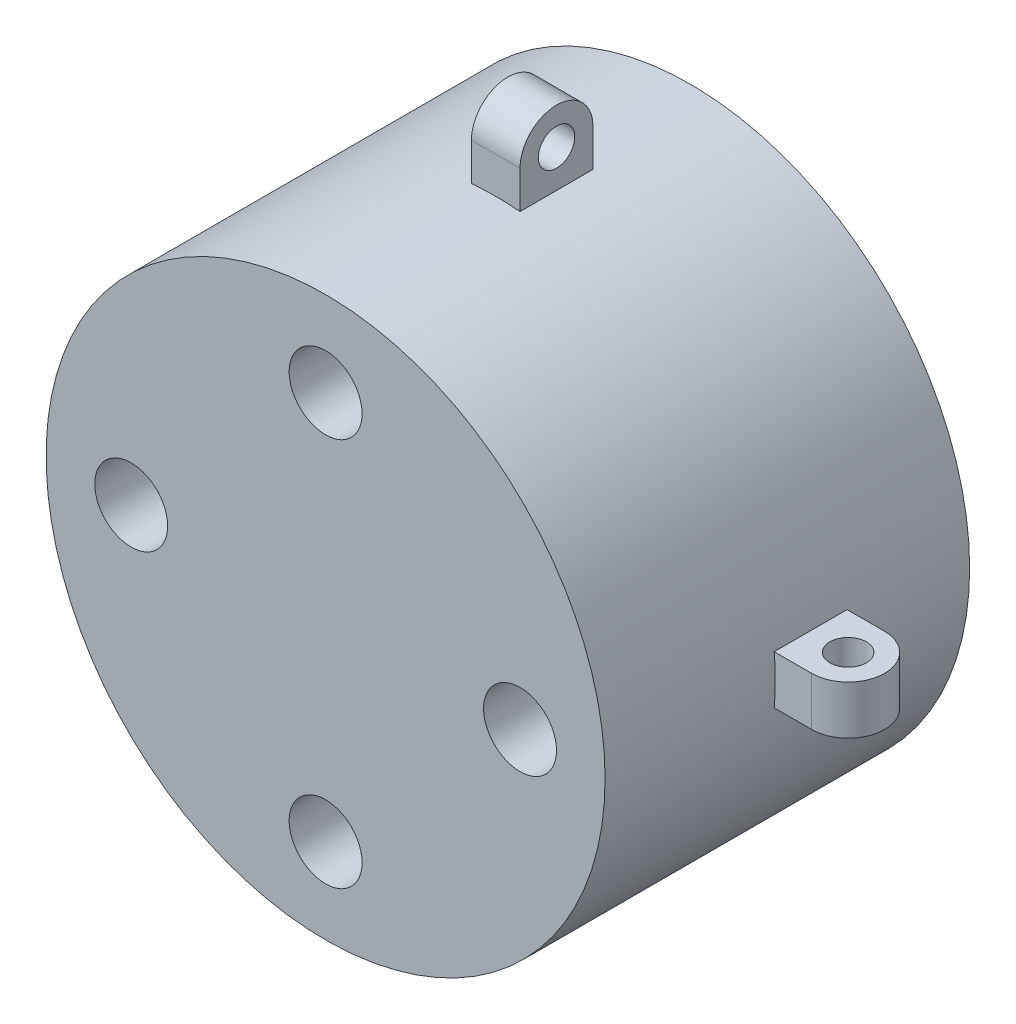
ISO-10303-21;
HEADER;
FILE_DESCRIPTION(('STEP AP214'),'2;1');
FILE_NAME('part.step','',(''),(''),'','','');
FILE_SCHEMA(('AUTOMOTIVE_DESIGN { 1 0 10303 214 1 1 1 1 }'));
ENDSEC;
DATA;
#1=APPLICATION_CONTEXT('core data for automotive mechanical design processes');
#2=APPLICATION_PROTOCOL_DEFINITION('international standard','automotive_design',2000,#1);
#3=PRODUCT_CONTEXT('',#1,'mechanical');
#4=PRODUCT('Part','Part','',(#3));
#5=PRODUCT_RELATED_PRODUCT_CATEGORY('part','',(#4));
#6=PRODUCT_DEFINITION_FORMATION('','',#4);
#7=PRODUCT_DEFINITION_CONTEXT('part definition',#1,'design');
#8=PRODUCT_DEFINITION('design','',#6,#7);
#9=PRODUCT_DEFINITION_SHAPE('','',#8);
#10=(LENGTH_UNIT() NAMED_UNIT(*) SI_UNIT(.MILLI.,.METRE.));
#11=(NAMED_UNIT(*) PLANE_ANGLE_UNIT() SI_UNIT($,.RADIAN.));
#12=(NAMED_UNIT(*) SI_UNIT($,.STERADIAN.) SOLID_ANGLE_UNIT());
#13=UNCERTAINTY_MEASURE_WITH_UNIT(LENGTH_MEASURE(1.E-05),#10,'distance_accuracy_value','');
#14=(GEOMETRIC_REPRESENTATION_CONTEXT(3) GLOBAL_UNCERTAINTY_ASSIGNED_CONTEXT((#13)) GLOBAL_UNIT_ASSIGNED_CONTEXT((#10,
#11,#12)) REPRESENTATION_CONTEXT('',''));
#15=CARTESIAN_POINT('',(0.,0.,0.));
#16=DIRECTION('',(0.,0.,1.));
#17=DIRECTION('',(1.,0.,0.));
#18=AXIS2_PLACEMENT_3D('',#15,#16,#17);
#19=CARTESIAN_POINT('',(0.,0.,30.));
#20=DIRECTION('',(0.,0.,-1.));
#21=DIRECTION('',(-1.,0.,0.));
#22=AXIS2_PLACEMENT_3D('',#19,#20,#21);
#23=CYLINDRICAL_SURFACE('',#22,23.);
#24=CARTESIAN_POINT('',(0.,0.,16.));
#25=DIRECTION('',(0.,0.,1.));
#26=DIRECTION('',(1.,0.,0.));
#27=AXIS2_PLACEMENT_3D('',#24,#25,#26);
#28=CIRCLE('',#27,23.);
#29=CARTESIAN_POINT('',(22.9128784747792,-1.99999999999976,16.));
#30=VERTEX_POINT('',#29);
#31=CARTESIAN_POINT('',(22.9128784747792,2.00000000000024,16.));
#32=VERTEX_POINT('',#31);
#33=EDGE_CURVE('E51',#30,#32,#28,.T.);
#34=ORIENTED_EDGE('',*,*,#33,.T.);
#35=DIRECTION('',(0.,0.,-1.));
#36=VECTOR('',#35,1.);
#37=CARTESIAN_POINT('',(22.9128784747792,2.00000000000024,30.));
#38=LINE('',#37,#36);
#39=CARTESIAN_POINT('',(22.9128784747792,2.00000000000024,10.));
#40=VERTEX_POINT('',#39);
#41=EDGE_CURVE('E11',#32,#40,#38,.T.);
#42=ORIENTED_EDGE('',*,*,#41,.T.);
#43=CARTESIAN_POINT('',(0.,0.,9.99999999999999));
#44=DIRECTION('',(0.,0.,-1.));
#45=DIRECTION('',(-1.,0.,0.));
#46=AXIS2_PLACEMENT_3D('',#43,#44,#45);
#47=CIRCLE('',#46,23.);
#48=CARTESIAN_POINT('',(22.9128784747792,-1.99999999999976,10.));
#49=VERTEX_POINT('',#48);
#50=EDGE_CURVE('E41',#40,#49,#47,.T.);
#51=ORIENTED_EDGE('',*,*,#50,.T.);
#52=DIRECTION('',(0.,0.,-1.));
#53=VECTOR('',#52,1.);
#54=CARTESIAN_POINT('',(22.9128784747792,-1.99999999999976,30.));
#55=LINE('',#54,#53);
#56=EDGE_CURVE('E150',#30,#49,#55,.T.);
#57=ORIENTED_EDGE('',*,*,#56,.F.);
#58=EDGE_LOOP('',(#34,#42,#51,#57));
#59=FACE_BOUND('',#58,.T.);
#60=CARTESIAN_POINT('',(0.,0.,16.));
#61=DIRECTION('',(0.,0.,1.));
#62=DIRECTION('',(1.,0.,0.));
#63=AXIS2_PLACEMENT_3D('',#60,#61,#62);
#64=CIRCLE('',#63,23.);
#65=CARTESIAN_POINT('',(-2.,-22.9128784747792,16.));
#66=VERTEX_POINT('',#65);
#67=CARTESIAN_POINT('',(2.,-22.9128784747792,16.));
#68=VERTEX_POINT('',#67);
#69=EDGE_CURVE('E297',#66,#68,#64,.T.);
#70=ORIENTED_EDGE('',*,*,#69,.T.);
#71=DIRECTION('',(0.,0.,-1.));
#72=VECTOR('',#71,1.);
#73=CARTESIAN_POINT('',(2.,-22.9128784747792,30.));
#74=LINE('',#73,#72);
#75=CARTESIAN_POINT('',(2.,-22.9128784747792,10.));
#76=VERTEX_POINT('',#75);
#77=EDGE_CURVE('E301',#68,#76,#74,.T.);
#78=ORIENTED_EDGE('',*,*,#77,.T.);
#79=CARTESIAN_POINT('',(0.,0.,9.99999999999999));
#80=DIRECTION('',(0.,0.,-1.));
#81=DIRECTION('',(0.,1.,0.));
#82=AXIS2_PLACEMENT_3D('',#79,#80,#81);
#83=CIRCLE('',#82,23.);
#84=CARTESIAN_POINT('',(-2.,-22.9128784747792,10.));
#85=VERTEX_POINT('',#84);
#86=EDGE_CURVE('E299',#76,#85,#83,.T.);
#87=ORIENTED_EDGE('',*,*,#86,.T.);
#88=DIRECTION('',(0.,0.,-1.));
#89=VECTOR('',#88,1.);
#90=CARTESIAN_POINT('',(-2.,-22.9128784747792,30.));
#91=LINE('',#90,#89);
#92=EDGE_CURVE('E294',#66,#85,#91,.T.);
#93=ORIENTED_EDGE('',*,*,#92,.F.);
#94=EDGE_LOOP('',(#70,#78,#87,#93));
#95=FACE_BOUND('',#94,.T.);
#96=CARTESIAN_POINT('',(0.,0.,16.));
#97=DIRECTION('',(0.,0.,1.));
#98=DIRECTION('',(1.,0.,0.));
#99=AXIS2_PLACEMENT_3D('',#96,#97,#98);
#100=CIRCLE('',#99,23.);
#101=CARTESIAN_POINT('',(-22.9128784747792,1.99999999999992,16.));
#102=VERTEX_POINT('',#101);
#103=CARTESIAN_POINT('',(-22.9128784747792,-2.00000000000008,16.));
#104=VERTEX_POINT('',#103);
#105=EDGE_CURVE('E288',#102,#104,#100,.T.);
#106=ORIENTED_EDGE('',*,*,#105,.T.);
#107=DIRECTION('',(0.,0.,-1.));
#108=VECTOR('',#107,1.);
#109=CARTESIAN_POINT('',(-22.9128784747792,-2.00000000000008,30.));
#110=LINE('',#109,#108);
#111=CARTESIAN_POINT('',(-22.9128784747792,-2.00000000000008,10.));
#112=VERTEX_POINT('',#111);
#113=EDGE_CURVE('E292',#104,#112,#110,.T.);
#114=ORIENTED_EDGE('',*,*,#113,.T.);
#115=CARTESIAN_POINT('',(0.,0.,9.99999999999999));
#116=DIRECTION('',(0.,0.,-1.));
#117=DIRECTION('',(-1.,0.,0.));
#118=AXIS2_PLACEMENT_3D('',#115,#116,#117);
#119=CIRCLE('',#118,23.);
#120=CARTESIAN_POINT('',(-22.9128784747792,1.99999999999992,10.));
#121=VERTEX_POINT('',#120);
#122=EDGE_CURVE('E290',#112,#121,#119,.T.);
#123=ORIENTED_EDGE('',*,*,#122,.T.);
#124=DIRECTION('',(0.,0.,-1.));
#125=VECTOR('',#124,1.);
#126=CARTESIAN_POINT('',(-22.9128784747792,1.99999999999992,30.));
#127=LINE('',#126,#125);
#128=EDGE_CURVE('E285',#102,#121,#127,.T.);
#129=ORIENTED_EDGE('',*,*,#128,.F.);
#130=EDGE_LOOP('',(#106,#114,#123,#129));
#131=FACE_BOUND('',#130,.T.);
#132=CARTESIAN_POINT('',(0.,0.,16.));
#133=DIRECTION('',(0.,0.,1.));
#134=DIRECTION('',(1.,0.,0.));
#135=AXIS2_PLACEMENT_3D('',#132,#133,#134);
#136=CIRCLE('',#135,23.);
#137=CARTESIAN_POINT('',(2.,22.9128784747792,16.));
#138=VERTEX_POINT('',#137);
#139=CARTESIAN_POINT('',(-2.,22.9128784747792,16.));
#140=VERTEX_POINT('',#139);
#141=EDGE_CURVE('E279',#138,#140,#136,.T.);
#142=ORIENTED_EDGE('',*,*,#141,.T.);
#143=DIRECTION('',(0.,0.,-1.));
#144=VECTOR('',#143,1.);
#145=CARTESIAN_POINT('',(-2.,22.9128784747792,30.));
#146=LINE('',#145,#144);
#147=CARTESIAN_POINT('',(-2.,22.9128784747792,10.));
#148=VERTEX_POINT('',#147);
#149=EDGE_CURVE('E283',#140,#148,#146,.T.);
#150=ORIENTED_EDGE('',*,*,#149,.T.);
#151=CARTESIAN_POINT('',(0.,0.,9.99999999999999));
#152=DIRECTION('',(0.,0.,-1.));
#153=DIRECTION('',(0.,1.,0.));
#154=AXIS2_PLACEMENT_3D('',#151,#152,#153);
#155=CIRCLE('',#154,23.);
#156=CARTESIAN_POINT('',(2.,22.9128784747792,10.));
#157=VERTEX_POINT('',#156);
#158=EDGE_CURVE('E281',#148,#157,#155,.T.);
#159=ORIENTED_EDGE('',*,*,#158,.T.);
#160=DIRECTION('',(0.,0.,-1.));
#161=VECTOR('',#160,1.);
#162=CARTESIAN_POINT('',(2.,22.9128784747792,30.));
#163=LINE('',#162,#161);
#164=EDGE_CURVE('E274',#138,#157,#163,.T.);
#165=ORIENTED_EDGE('',*,*,#164,.F.);
#166=EDGE_LOOP('',(#142,#150,#159,#165));
#167=FACE_BOUND('',#166,.T.);
#168=CARTESIAN_POINT('',(0.,0.,30.));
#169=DIRECTION('',(0.,0.,1.));
#170=DIRECTION('',(1.,0.,0.));
#171=AXIS2_PLACEMENT_3D('',#168,#169,#170);
#172=CIRCLE('',#171,23.);
#173=CARTESIAN_POINT('',(23.,0.,30.));
#174=VERTEX_POINT('',#173);
#175=EDGE_CURVE('E271',#174,#174,#172,.T.);
#176=ORIENTED_EDGE('',*,*,#175,.F.);
#177=EDGE_LOOP('',(#176));
#178=FACE_BOUND('',#177,.T.);
#179=CARTESIAN_POINT('',(0.,0.,0.));
#180=DIRECTION('',(0.,0.,1.));
#181=DIRECTION('',(1.,0.,0.));
#182=AXIS2_PLACEMENT_3D('',#179,#180,#181);
#183=CIRCLE('',#182,23.);
#184=CARTESIAN_POINT('',(23.,0.,0.));
#185=VERTEX_POINT('',#184);
#186=EDGE_CURVE('E250',#185,#185,#183,.T.);
#187=ORIENTED_EDGE('',*,*,#186,.T.);
#188=EDGE_LOOP('',(#187));
#189=FACE_BOUND('',#188,.T.);
#190=ADVANCED_FACE('F34',(#59,#95,#131,#167,#178,#189),#23,.T.);
#191=CARTESIAN_POINT('',(0.,0.,30.));
#192=DIRECTION('',(0.,0.,1.));
#193=DIRECTION('',(1.,0.,0.));
#194=AXIS2_PLACEMENT_3D('',#191,#192,#193);
#195=PLANE('',#194);
#196=CARTESIAN_POINT('',(16.,0.,30.));
#197=DIRECTION('',(0.,0.,1.));
#198=DIRECTION('',(1.,0.,0.));
#199=AXIS2_PLACEMENT_3D('',#196,#197,#198);
#200=CIRCLE('',#199,3.);
#201=CARTESIAN_POINT('',(19.,0.,30.));
#202=VERTEX_POINT('',#201);
#203=EDGE_CURVE('E251',#202,#202,#200,.T.);
#204=ORIENTED_EDGE('',*,*,#203,.F.);
#205=EDGE_LOOP('',(#204));
#206=FACE_BOUND('',#205,.T.);
#207=CARTESIAN_POINT('',(0.,16.,30.));
#208=DIRECTION('',(0.,0.,1.));
#209=DIRECTION('',(1.,0.,0.));
#210=AXIS2_PLACEMENT_3D('',#207,#208,#209);
#211=CIRCLE('',#210,3.);
#212=CARTESIAN_POINT('',(3.,16.,30.));
#213=VERTEX_POINT('',#212);
#214=EDGE_CURVE('E257',#213,#213,#211,.T.);
#215=ORIENTED_EDGE('',*,*,#214,.F.);
#216=EDGE_LOOP('',(#215));
#217=FACE_BOUND('',#216,.T.);
#218=CARTESIAN_POINT('',(-16.,0.,30.));
#219=DIRECTION('',(0.,0.,1.));
#220=DIRECTION('',(1.,0.,0.));
#221=AXIS2_PLACEMENT_3D('',#218,#219,#220);
#222=CIRCLE('',#221,3.);
#223=CARTESIAN_POINT('',(-13.,0.,30.));
#224=VERTEX_POINT('',#223);
#225=EDGE_CURVE('E263',#224,#224,#222,.T.);
#226=ORIENTED_EDGE('',*,*,#225,.F.);
#227=EDGE_LOOP('',(#226));
#228=FACE_BOUND('',#227,.T.);
#229=CARTESIAN_POINT('',(0.,-16.,30.));
#230=DIRECTION('',(0.,0.,1.));
#231=DIRECTION('',(1.,0.,0.));
#232=AXIS2_PLACEMENT_3D('',#229,#230,#231);
#233=CIRCLE('',#232,3.);
#234=CARTESIAN_POINT('',(3.,-16.,30.));
#235=VERTEX_POINT('',#234);
#236=EDGE_CURVE('E244',#235,#235,#233,.T.);
#237=ORIENTED_EDGE('',*,*,#236,.F.);
#238=EDGE_LOOP('',(#237));
#239=FACE_BOUND('',#238,.T.);
#240=ORIENTED_EDGE('',*,*,#175,.T.);
#241=EDGE_LOOP('',(#240));
#242=FACE_BOUND('',#241,.T.);
#243=ADVANCED_FACE('F321',(#206,#217,#228,#239,#242),#195,.T.);
#244=CARTESIAN_POINT('',(0.,0.,0.));
#245=DIRECTION('',(0.,0.,1.));
#246=DIRECTION('',(1.,0.,0.));
#247=AXIS2_PLACEMENT_3D('',#244,#245,#246);
#248=PLANE('',#247);
#249=CARTESIAN_POINT('',(16.,0.,0.));
#250=DIRECTION('',(0.,0.,1.));
#251=DIRECTION('',(1.,0.,0.));
#252=AXIS2_PLACEMENT_3D('',#249,#250,#251);
#253=CIRCLE('',#252,3.);
#254=CARTESIAN_POINT('',(19.,0.,0.));
#255=VERTEX_POINT('',#254);
#256=EDGE_CURVE('E247',#255,#255,#253,.T.);
#257=ORIENTED_EDGE('',*,*,#256,.T.);
#258=EDGE_LOOP('',(#257));
#259=FACE_BOUND('',#258,.T.);
#260=CARTESIAN_POINT('',(0.,16.,0.));
#261=DIRECTION('',(0.,0.,1.));
#262=DIRECTION('',(1.,0.,0.));
#263=AXIS2_PLACEMENT_3D('',#260,#261,#262);
#264=CIRCLE('',#263,3.);
#265=CARTESIAN_POINT('',(3.,16.,0.));
#266=VERTEX_POINT('',#265);
#267=EDGE_CURVE('E254',#266,#266,#264,.T.);
#268=ORIENTED_EDGE('',*,*,#267,.T.);
#269=EDGE_LOOP('',(#268));
#270=FACE_BOUND('',#269,.T.);
#271=CARTESIAN_POINT('',(-16.,0.,0.));
#272=DIRECTION('',(0.,0.,1.));
#273=DIRECTION('',(1.,0.,0.));
#274=AXIS2_PLACEMENT_3D('',#271,#272,#273);
#275=CIRCLE('',#274,3.);
#276=CARTESIAN_POINT('',(-13.,0.,0.));
#277=VERTEX_POINT('',#276);
#278=EDGE_CURVE('E260',#277,#277,#275,.T.);
#279=ORIENTED_EDGE('',*,*,#278,.T.);
#280=EDGE_LOOP('',(#279));
#281=FACE_BOUND('',#280,.T.);
#282=CARTESIAN_POINT('',(0.,-16.,0.));
#283=DIRECTION('',(0.,0.,1.));
#284=DIRECTION('',(1.,0.,0.));
#285=AXIS2_PLACEMENT_3D('',#282,#283,#284);
#286=CIRCLE('',#285,3.);
#287=CARTESIAN_POINT('',(3.,-16.,0.));
#288=VERTEX_POINT('',#287);
#289=EDGE_CURVE('E266',#288,#288,#286,.T.);
#290=ORIENTED_EDGE('',*,*,#289,.T.);
#291=EDGE_LOOP('',(#290));
#292=FACE_BOUND('',#291,.T.);
#293=ORIENTED_EDGE('',*,*,#186,.F.);
#294=EDGE_LOOP('',(#293));
#295=FACE_BOUND('',#294,.T.);
#296=ADVANCED_FACE('F325',(#259,#270,#281,#292,#295),#248,.F.);
#297=CARTESIAN_POINT('',(0.,-16.,0.));
#298=DIRECTION('',(0.,0.,1.));
#299=DIRECTION('',(1.,0.,0.));
#300=AXIS2_PLACEMENT_3D('',#297,#298,#299);
#301=CYLINDRICAL_SURFACE('',#300,3.);
#302=ORIENTED_EDGE('',*,*,#289,.F.);
#303=EDGE_LOOP('',(#302));
#304=FACE_BOUND('',#303,.T.);
#305=ORIENTED_EDGE('',*,*,#236,.T.);
#306=EDGE_LOOP('',(#305));
#307=FACE_BOUND('',#306,.T.);
#308=ADVANCED_FACE('F331',(#304,#307),#301,.F.);
#309=CARTESIAN_POINT('',(-16.,0.,0.));
#310=DIRECTION('',(0.,0.,1.));
#311=DIRECTION('',(1.,0.,0.));
#312=AXIS2_PLACEMENT_3D('',#309,#310,#311);
#313=CYLINDRICAL_SURFACE('',#312,3.);
#314=ORIENTED_EDGE('',*,*,#278,.F.);
#315=EDGE_LOOP('',(#314));
#316=FACE_BOUND('',#315,.T.);
#317=ORIENTED_EDGE('',*,*,#225,.T.);
#318=EDGE_LOOP('',(#317));
#319=FACE_BOUND('',#318,.T.);
#320=ADVANCED_FACE('F338',(#316,#319),#313,.F.);
#321=CARTESIAN_POINT('',(0.,16.,0.));
#322=DIRECTION('',(0.,0.,1.));
#323=DIRECTION('',(1.,0.,0.));
#324=AXIS2_PLACEMENT_3D('',#321,#322,#323);
#325=CYLINDRICAL_SURFACE('',#324,3.);
#326=ORIENTED_EDGE('',*,*,#267,.F.);
#327=EDGE_LOOP('',(#326));
#328=FACE_BOUND('',#327,.T.);
#329=ORIENTED_EDGE('',*,*,#214,.T.);
#330=EDGE_LOOP('',(#329));
#331=FACE_BOUND('',#330,.T.);
#332=ADVANCED_FACE('F342',(#328,#331),#325,.F.);
#333=CARTESIAN_POINT('',(16.,0.,0.));
#334=DIRECTION('',(0.,0.,1.));
#335=DIRECTION('',(1.,0.,0.));
#336=AXIS2_PLACEMENT_3D('',#333,#334,#335);
#337=CYLINDRICAL_SURFACE('',#336,3.);
#338=ORIENTED_EDGE('',*,*,#256,.F.);
#339=EDGE_LOOP('',(#338));
#340=FACE_BOUND('',#339,.T.);
#341=ORIENTED_EDGE('',*,*,#203,.T.);
#342=EDGE_LOOP('',(#341));
#343=FACE_BOUND('',#342,.T.);
#344=ADVANCED_FACE('F346',(#340,#343),#337,.F.);
#345=CARTESIAN_POINT('',(-2.,26.,13.));
#346=DIRECTION('',(-1.,0.,0.));
#347=DIRECTION('',(0.,0.,1.));
#348=AXIS2_PLACEMENT_3D('',#345,#346,#347);
#349=PLANE('',#348);
#350=CARTESIAN_POINT('',(-2.,26.,13.));
#351=DIRECTION('',(-1.,0.,0.));
#352=DIRECTION('',(0.,0.,1.));
#353=AXIS2_PLACEMENT_3D('',#350,#351,#352);
#354=CIRCLE('',#353,1.5);
#355=CARTESIAN_POINT('',(-2.,26.,14.5));
#356=VERTEX_POINT('',#355);
#357=EDGE_CURVE('E222',#356,#356,#354,.T.);
#358=ORIENTED_EDGE('',*,*,#357,.F.);
#359=EDGE_LOOP('',(#358));
#360=FACE_BOUND('',#359,.T.);
#361=ORIENTED_EDGE('',*,*,#149,.F.);
#362=DIRECTION('',(0.,-1.,0.));
#363=VECTOR('',#362,1.);
#364=CARTESIAN_POINT('',(-2.,22.,16.));
#365=LINE('',#364,#363);
#366=CARTESIAN_POINT('',(-2.,26.,16.));
#367=VERTEX_POINT('',#366);
#368=EDGE_CURVE('E238',#367,#140,#365,.T.);
#369=ORIENTED_EDGE('',*,*,#368,.F.);
#370=CARTESIAN_POINT('',(-2.,26.,13.));
#371=DIRECTION('',(1.,0.,0.));
#372=DIRECTION('',(0.,0.,1.));
#373=AXIS2_PLACEMENT_3D('',#370,#371,#372);
#374=CIRCLE('',#373,3.);
#375=CARTESIAN_POINT('',(-2.,26.,10.));
#376=VERTEX_POINT('',#375);
#377=EDGE_CURVE('E235',#376,#367,#374,.T.);
#378=ORIENTED_EDGE('',*,*,#377,.F.);
#379=DIRECTION('',(0.,1.,0.));
#380=VECTOR('',#379,1.);
#381=CARTESIAN_POINT('',(-2.,26.,10.));
#382=LINE('',#381,#380);
#383=EDGE_CURVE('E233',#148,#376,#382,.T.);
#384=ORIENTED_EDGE('',*,*,#383,.F.);
#385=EDGE_LOOP('',(#361,#369,#378,#384));
#386=FACE_BOUND('',#385,.T.);
#387=ADVANCED_FACE('F350',(#360,#386),#349,.T.);
#388=CARTESIAN_POINT('',(2.,26.,13.));
#389=DIRECTION('',(-1.,0.,0.));
#390=DIRECTION('',(0.,0.,1.));
#391=AXIS2_PLACEMENT_3D('',#388,#389,#390);
#392=PLANE('',#391);
#393=CARTESIAN_POINT('',(2.,26.,13.));
#394=DIRECTION('',(1.,0.,0.));
#395=DIRECTION('',(0.,0.,-1.));
#396=AXIS2_PLACEMENT_3D('',#393,#394,#395);
#397=CIRCLE('',#396,1.5);
#398=CARTESIAN_POINT('',(2.,26.,11.5));
#399=VERTEX_POINT('',#398);
#400=EDGE_CURVE('E217',#399,#399,#397,.T.);
#401=ORIENTED_EDGE('',*,*,#400,.F.);
#402=EDGE_LOOP('',(#401));
#403=FACE_BOUND('',#402,.T.);
#404=DIRECTION('',(0.,-1.,0.));
#405=VECTOR('',#404,1.);
#406=CARTESIAN_POINT('',(2.,22.,16.));
#407=LINE('',#406,#405);
#408=CARTESIAN_POINT('',(2.,26.,16.));
#409=VERTEX_POINT('',#408);
#410=EDGE_CURVE('E230',#409,#138,#407,.T.);
#411=ORIENTED_EDGE('',*,*,#410,.T.);
#412=ORIENTED_EDGE('',*,*,#164,.T.);
#413=DIRECTION('',(0.,1.,0.));
#414=VECTOR('',#413,1.);
#415=CARTESIAN_POINT('',(2.,26.,10.));
#416=LINE('',#415,#414);
#417=CARTESIAN_POINT('',(2.,26.,10.));
#418=VERTEX_POINT('',#417);
#419=EDGE_CURVE('E225',#157,#418,#416,.T.);
#420=ORIENTED_EDGE('',*,*,#419,.T.);
#421=CARTESIAN_POINT('',(2.,26.,13.));
#422=DIRECTION('',(1.,0.,0.));
#423=DIRECTION('',(0.,0.,1.));
#424=AXIS2_PLACEMENT_3D('',#421,#422,#423);
#425=CIRCLE('',#424,3.);
#426=EDGE_CURVE('E227',#418,#409,#425,.T.);
#427=ORIENTED_EDGE('',*,*,#426,.T.);
#428=EDGE_LOOP('',(#411,#412,#420,#427));
#429=FACE_BOUND('',#428,.T.);
#430=ADVANCED_FACE('F356',(#403,#429),#392,.F.);
#431=CARTESIAN_POINT('',(-2.,26.,10.));
#432=DIRECTION('',(0.,0.,-1.));
#433=DIRECTION('',(0.,1.,0.));
#434=AXIS2_PLACEMENT_3D('',#431,#432,#433);
#435=PLANE('',#434);
#436=ORIENTED_EDGE('',*,*,#158,.F.);
#437=ORIENTED_EDGE('',*,*,#383,.T.);
#438=DIRECTION('',(1.,0.,0.));
#439=VECTOR('',#438,1.);
#440=CARTESIAN_POINT('',(-2.,26.,10.));
#441=LINE('',#440,#439);
#442=EDGE_CURVE('E241',#376,#418,#441,.T.);
#443=ORIENTED_EDGE('',*,*,#442,.T.);
#444=ORIENTED_EDGE('',*,*,#419,.F.);
#445=EDGE_LOOP('',(#436,#437,#443,#444));
#446=FACE_BOUND('',#445,.T.);
#447=ADVANCED_FACE('F352',(#446),#435,.T.);
#448=CARTESIAN_POINT('',(-2.,22.,16.));
#449=DIRECTION('',(0.,0.,1.));
#450=DIRECTION('',(1.,0.,0.));
#451=AXIS2_PLACEMENT_3D('',#448,#449,#450);
#452=PLANE('',#451);
#453=ORIENTED_EDGE('',*,*,#141,.F.);
#454=ORIENTED_EDGE('',*,*,#410,.F.);
#455=DIRECTION('',(1.,0.,0.));
#456=VECTOR('',#455,1.);
#457=CARTESIAN_POINT('',(-2.,26.,16.));
#458=LINE('',#457,#456);
#459=EDGE_CURVE('E242',#367,#409,#458,.T.);
#460=ORIENTED_EDGE('',*,*,#459,.F.);
#461=ORIENTED_EDGE('',*,*,#368,.T.);
#462=EDGE_LOOP('',(#453,#454,#460,#461));
#463=FACE_BOUND('',#462,.T.);
#464=ADVANCED_FACE('F355',(#463),#452,.T.);
#465=CARTESIAN_POINT('',(-2.,26.,13.));
#466=DIRECTION('',(1.,0.,0.));
#467=DIRECTION('',(0.,0.,-1.));
#468=AXIS2_PLACEMENT_3D('',#465,#466,#467);
#469=CYLINDRICAL_SURFACE('',#468,3.);
#470=ORIENTED_EDGE('',*,*,#459,.T.);
#471=ORIENTED_EDGE('',*,*,#426,.F.);
#472=ORIENTED_EDGE('',*,*,#442,.F.);
#473=ORIENTED_EDGE('',*,*,#377,.T.);
#474=EDGE_LOOP('',(#470,#471,#472,#473));
#475=FACE_BOUND('',#474,.T.);
#476=ADVANCED_FACE('F358',(#475),#469,.T.);
#477=CARTESIAN_POINT('',(-23.,26.,13.));
#478=DIRECTION('',(1.,0.,0.));
#479=DIRECTION('',(0.,0.,-1.));
#480=AXIS2_PLACEMENT_3D('',#477,#478,#479);
#481=CYLINDRICAL_SURFACE('',#480,1.5);
#482=ORIENTED_EDGE('',*,*,#357,.T.);
#483=EDGE_LOOP('',(#482));
#484=FACE_BOUND('',#483,.T.);
#485=ORIENTED_EDGE('',*,*,#400,.T.);
#486=EDGE_LOOP('',(#485));
#487=FACE_BOUND('',#486,.T.);
#488=ADVANCED_FACE('F361',(#484,#487),#481,.F.);
#489=CARTESIAN_POINT('',(-26.,-2.00000000000009,13.));
#490=DIRECTION('',(0.,-1.,0.));
#491=DIRECTION('',(0.,0.,1.));
#492=AXIS2_PLACEMENT_3D('',#489,#490,#491);
#493=PLANE('',#492);
#494=CARTESIAN_POINT('',(-26.,-2.00000000000009,13.));
#495=DIRECTION('',(0.,-1.,0.));
#496=DIRECTION('',(1.,0.,0.));
#497=AXIS2_PLACEMENT_3D('',#494,#495,#496);
#498=CIRCLE('',#497,1.5);
#499=CARTESIAN_POINT('',(-24.5,-2.00000000000009,13.));
#500=VERTEX_POINT('',#499);
#501=EDGE_CURVE('E152',#500,#500,#498,.T.);
#502=ORIENTED_EDGE('',*,*,#501,.F.);
#503=EDGE_LOOP('',(#502));
#504=FACE_BOUND('',#503,.T.);
#505=ORIENTED_EDGE('',*,*,#113,.F.);
#506=DIRECTION('',(1.,0.,0.));
#507=VECTOR('',#506,1.);
#508=CARTESIAN_POINT('',(-22.,-2.00000000000008,16.));
#509=LINE('',#508,#507);
#510=CARTESIAN_POINT('',(-26.,-2.00000000000009,16.));
#511=VERTEX_POINT('',#510);
#512=EDGE_CURVE('E211',#511,#104,#509,.T.);
#513=ORIENTED_EDGE('',*,*,#512,.F.);
#514=CARTESIAN_POINT('',(-26.,-2.00000000000009,13.));
#515=DIRECTION('',(0.,1.,0.));
#516=DIRECTION('',(0.,0.,1.));
#517=AXIS2_PLACEMENT_3D('',#514,#515,#516);
#518=CIRCLE('',#517,3.);
#519=CARTESIAN_POINT('',(-26.,-2.00000000000009,10.));
#520=VERTEX_POINT('',#519);
#521=EDGE_CURVE('E208',#520,#511,#518,.T.);
#522=ORIENTED_EDGE('',*,*,#521,.F.);
#523=DIRECTION('',(-1.,0.,0.));
#524=VECTOR('',#523,1.);
#525=CARTESIAN_POINT('',(-26.,-2.00000000000009,10.));
#526=LINE('',#525,#524);
#527=EDGE_CURVE('E206',#112,#520,#526,.T.);
#528=ORIENTED_EDGE('',*,*,#527,.F.);
#529=EDGE_LOOP('',(#505,#513,#522,#528));
#530=FACE_BOUND('',#529,.T.);
#531=ADVANCED_FACE('F374',(#504,#530),#493,.T.);
#532=CARTESIAN_POINT('',(-26.,1.99999999999991,13.));
#533=DIRECTION('',(0.,-1.,0.));
#534=DIRECTION('',(0.,0.,1.));
#535=AXIS2_PLACEMENT_3D('',#532,#533,#534);
#536=PLANE('',#535);
#537=CARTESIAN_POINT('',(-26.,1.99999999999991,13.));
#538=DIRECTION('',(0.,1.,0.));
#539=DIRECTION('',(0.,0.,-1.));
#540=AXIS2_PLACEMENT_3D('',#537,#538,#539);
#541=CIRCLE('',#540,1.5);
#542=CARTESIAN_POINT('',(-26.,1.99999999999991,11.5));
#543=VERTEX_POINT('',#542);
#544=EDGE_CURVE('E464',#543,#543,#541,.T.);
#545=ORIENTED_EDGE('',*,*,#544,.F.);
#546=EDGE_LOOP('',(#545));
#547=FACE_BOUND('',#546,.T.);
#548=DIRECTION('',(1.,0.,0.));
#549=VECTOR('',#548,1.);
#550=CARTESIAN_POINT('',(-22.,1.99999999999992,16.));
#551=LINE('',#550,#549);
#552=CARTESIAN_POINT('',(-26.,1.99999999999991,16.));
#553=VERTEX_POINT('',#552);
#554=EDGE_CURVE('E203',#553,#102,#551,.T.);
#555=ORIENTED_EDGE('',*,*,#554,.T.);
#556=ORIENTED_EDGE('',*,*,#128,.T.);
#557=DIRECTION('',(-1.,0.,0.));
#558=VECTOR('',#557,1.);
#559=CARTESIAN_POINT('',(-26.,1.99999999999991,10.));
#560=LINE('',#559,#558);
#561=CARTESIAN_POINT('',(-26.,1.99999999999991,10.));
#562=VERTEX_POINT('',#561);
#563=EDGE_CURVE('E196',#121,#562,#560,.T.);
#564=ORIENTED_EDGE('',*,*,#563,.T.);
#565=CARTESIAN_POINT('',(-26.,1.99999999999991,13.));
#566=DIRECTION('',(0.,1.,0.));
#567=DIRECTION('',(0.,0.,1.));
#568=AXIS2_PLACEMENT_3D('',#565,#566,#567);
#569=CIRCLE('',#568,3.);
#570=EDGE_CURVE('E200',#562,#553,#569,.T.);
#571=ORIENTED_EDGE('',*,*,#570,.T.);
#572=EDGE_LOOP('',(#555,#556,#564,#571));
#573=FACE_BOUND('',#572,.T.);
#574=ADVANCED_FACE('F380',(#547,#573),#536,.F.);
#575=CARTESIAN_POINT('',(-26.,-2.00000000000009,10.));
#576=DIRECTION('',(0.,0.,-1.));
#577=DIRECTION('',(-1.,0.,0.));
#578=AXIS2_PLACEMENT_3D('',#575,#576,#577);
#579=PLANE('',#578);
#580=ORIENTED_EDGE('',*,*,#122,.F.);
#581=ORIENTED_EDGE('',*,*,#527,.T.);
#582=DIRECTION('',(0.,1.,0.));
#583=VECTOR('',#582,1.);
#584=CARTESIAN_POINT('',(-26.,-2.00000000000009,10.));
#585=LINE('',#584,#583);
#586=EDGE_CURVE('E214',#520,#562,#585,.T.);
#587=ORIENTED_EDGE('',*,*,#586,.T.);
#588=ORIENTED_EDGE('',*,*,#563,.F.);
#589=EDGE_LOOP('',(#580,#581,#587,#588));
#590=FACE_BOUND('',#589,.T.);
#591=ADVANCED_FACE('F376',(#590),#579,.T.);
#592=CARTESIAN_POINT('',(-22.,-2.00000000000008,16.));
#593=DIRECTION('',(0.,0.,1.));
#594=DIRECTION('',(1.,0.,0.));
#595=AXIS2_PLACEMENT_3D('',#592,#593,#594);
#596=PLANE('',#595);
#597=ORIENTED_EDGE('',*,*,#105,.F.);
#598=ORIENTED_EDGE('',*,*,#554,.F.);
#599=DIRECTION('',(0.,1.,0.));
#600=VECTOR('',#599,1.);
#601=CARTESIAN_POINT('',(-26.,-2.00000000000009,16.));
#602=LINE('',#601,#600);
#603=EDGE_CURVE('E215',#511,#553,#602,.T.);
#604=ORIENTED_EDGE('',*,*,#603,.F.);
#605=ORIENTED_EDGE('',*,*,#512,.T.);
#606=EDGE_LOOP('',(#597,#598,#604,#605));
#607=FACE_BOUND('',#606,.T.);
#608=ADVANCED_FACE('F379',(#607),#596,.T.);
#609=CARTESIAN_POINT('',(-26.,-2.00000000000009,13.));
#610=DIRECTION('',(0.,1.,0.));
#611=DIRECTION('',(-1.,0.,0.));
#612=AXIS2_PLACEMENT_3D('',#609,#610,#611);
#613=CYLINDRICAL_SURFACE('',#612,3.);
#614=ORIENTED_EDGE('',*,*,#603,.T.);
#615=ORIENTED_EDGE('',*,*,#570,.F.);
#616=ORIENTED_EDGE('',*,*,#586,.F.);
#617=ORIENTED_EDGE('',*,*,#521,.T.);
#618=EDGE_LOOP('',(#614,#615,#616,#617));
#619=FACE_BOUND('',#618,.T.);
#620=ADVANCED_FACE('F382',(#619),#613,.T.);
#621=CARTESIAN_POINT('',(2.,-26.,13.));
#622=DIRECTION('',(1.,0.,0.));
#623=DIRECTION('',(0.,0.,1.));
#624=AXIS2_PLACEMENT_3D('',#621,#622,#623);
#625=PLANE('',#624);
#626=CARTESIAN_POINT('',(2.,-26.,13.));
#627=DIRECTION('',(1.,0.,0.));
#628=DIRECTION('',(0.,0.,-1.));
#629=AXIS2_PLACEMENT_3D('',#626,#627,#628);
#630=CIRCLE('',#629,1.5);
#631=CARTESIAN_POINT('',(2.,-26.,11.5));
#632=VERTEX_POINT('',#631);
#633=EDGE_CURVE('E475',#632,#632,#630,.T.);
#634=ORIENTED_EDGE('',*,*,#633,.F.);
#635=EDGE_LOOP('',(#634));
#636=FACE_BOUND('',#635,.T.);
#637=ORIENTED_EDGE('',*,*,#77,.F.);
#638=DIRECTION('',(0.,1.,0.));
#639=VECTOR('',#638,1.);
#640=CARTESIAN_POINT('',(2.,-22.,16.));
#641=LINE('',#640,#639);
#642=CARTESIAN_POINT('',(2.,-26.,16.));
#643=VERTEX_POINT('',#642);
#644=EDGE_CURVE('E190',#643,#68,#641,.T.);
#645=ORIENTED_EDGE('',*,*,#644,.F.);
#646=CARTESIAN_POINT('',(2.,-26.,13.));
#647=DIRECTION('',(-1.,0.,0.));
#648=DIRECTION('',(0.,0.,1.));
#649=AXIS2_PLACEMENT_3D('',#646,#647,#648);
#650=CIRCLE('',#649,3.);
#651=CARTESIAN_POINT('',(2.,-26.,10.));
#652=VERTEX_POINT('',#651);
#653=EDGE_CURVE('E187',#652,#643,#650,.T.);
#654=ORIENTED_EDGE('',*,*,#653,.F.);
#655=DIRECTION('',(0.,-1.,0.));
#656=VECTOR('',#655,1.);
#657=CARTESIAN_POINT('',(2.,-26.,10.));
#658=LINE('',#657,#656);
#659=EDGE_CURVE('E185',#76,#652,#658,.T.);
#660=ORIENTED_EDGE('',*,*,#659,.F.);
#661=EDGE_LOOP('',(#637,#645,#654,#660));
#662=FACE_BOUND('',#661,.T.);
#663=ADVANCED_FACE('F385',(#636,#662),#625,.T.);
#664=CARTESIAN_POINT('',(-2.,-26.,13.));
#665=DIRECTION('',(1.,0.,0.));
#666=DIRECTION('',(0.,0.,1.));
#667=AXIS2_PLACEMENT_3D('',#664,#665,#666);
#668=PLANE('',#667);
#669=CARTESIAN_POINT('',(-2.,-26.,13.));
#670=DIRECTION('',(-1.,0.,0.));
#671=DIRECTION('',(0.,0.,-1.));
#672=AXIS2_PLACEMENT_3D('',#669,#670,#671);
#673=CIRCLE('',#672,1.5);
#674=CARTESIAN_POINT('',(-2.,-26.,11.5));
#675=VERTEX_POINT('',#674);
#676=EDGE_CURVE('E419',#675,#675,#673,.T.);
#677=ORIENTED_EDGE('',*,*,#676,.F.);
#678=EDGE_LOOP('',(#677));
#679=FACE_BOUND('',#678,.T.);
#680=DIRECTION('',(0.,1.,0.));
#681=VECTOR('',#680,1.);
#682=CARTESIAN_POINT('',(-2.,-22.,16.));
#683=LINE('',#682,#681);
#684=CARTESIAN_POINT('',(-2.,-26.,16.));
#685=VERTEX_POINT('',#684);
#686=EDGE_CURVE('E182',#685,#66,#683,.T.);
#687=ORIENTED_EDGE('',*,*,#686,.T.);
#688=ORIENTED_EDGE('',*,*,#92,.T.);
#689=DIRECTION('',(0.,-1.,0.));
#690=VECTOR('',#689,1.);
#691=CARTESIAN_POINT('',(-2.,-26.,10.));
#692=LINE('',#691,#690);
#693=CARTESIAN_POINT('',(-2.,-26.,10.));
#694=VERTEX_POINT('',#693);
#695=EDGE_CURVE('E176',#85,#694,#692,.T.);
#696=ORIENTED_EDGE('',*,*,#695,.T.);
#697=CARTESIAN_POINT('',(-2.,-26.,13.));
#698=DIRECTION('',(-1.,0.,0.));
#699=DIRECTION('',(0.,0.,1.));
#700=AXIS2_PLACEMENT_3D('',#697,#698,#699);
#701=CIRCLE('',#700,3.);
#702=EDGE_CURVE('E179',#694,#685,#701,.T.);
#703=ORIENTED_EDGE('',*,*,#702,.T.);
#704=EDGE_LOOP('',(#687,#688,#696,#703));
#705=FACE_BOUND('',#704,.T.);
#706=ADVANCED_FACE('F400',(#679,#705),#668,.F.);
#707=CARTESIAN_POINT('',(2.,-26.,10.));
#708=DIRECTION('',(0.,0.,-1.));
#709=DIRECTION('',(0.,1.,0.));
#710=AXIS2_PLACEMENT_3D('',#707,#708,#709);
#711=PLANE('',#710);
#712=ORIENTED_EDGE('',*,*,#86,.F.);
#713=ORIENTED_EDGE('',*,*,#659,.T.);
#714=DIRECTION('',(-1.,0.,0.));
#715=VECTOR('',#714,1.);
#716=CARTESIAN_POINT('',(2.,-26.,10.));
#717=LINE('',#716,#715);
#718=EDGE_CURVE('E193',#652,#694,#717,.T.);
#719=ORIENTED_EDGE('',*,*,#718,.T.);
#720=ORIENTED_EDGE('',*,*,#695,.F.);
#721=EDGE_LOOP('',(#712,#713,#719,#720));
#722=FACE_BOUND('',#721,.T.);
#723=ADVANCED_FACE('F396',(#722),#711,.T.);
#724=CARTESIAN_POINT('',(2.,-22.,16.));
#725=DIRECTION('',(0.,0.,1.));
#726=DIRECTION('',(1.,0.,0.));
#727=AXIS2_PLACEMENT_3D('',#724,#725,#726);
#728=PLANE('',#727);
#729=ORIENTED_EDGE('',*,*,#69,.F.);
#730=ORIENTED_EDGE('',*,*,#686,.F.);
#731=DIRECTION('',(-1.,0.,0.));
#732=VECTOR('',#731,1.);
#733=CARTESIAN_POINT('',(2.,-26.,16.));
#734=LINE('',#733,#732);
#735=EDGE_CURVE('E194',#643,#685,#734,.T.);
#736=ORIENTED_EDGE('',*,*,#735,.F.);
#737=ORIENTED_EDGE('',*,*,#644,.T.);
#738=EDGE_LOOP('',(#729,#730,#736,#737));
#739=FACE_BOUND('',#738,.T.);
#740=ADVANCED_FACE('F399',(#739),#728,.T.);
#741=CARTESIAN_POINT('',(2.,-26.,13.));
#742=DIRECTION('',(-1.,0.,0.));
#743=DIRECTION('',(0.,0.,1.));
#744=AXIS2_PLACEMENT_3D('',#741,#742,#743);
#745=CYLINDRICAL_SURFACE('',#744,3.);
#746=ORIENTED_EDGE('',*,*,#735,.T.);
#747=ORIENTED_EDGE('',*,*,#702,.F.);
#748=ORIENTED_EDGE('',*,*,#718,.F.);
#749=ORIENTED_EDGE('',*,*,#653,.T.);
#750=EDGE_LOOP('',(#746,#747,#748,#749));
#751=FACE_BOUND('',#750,.T.);
#752=ADVANCED_FACE('F402',(#751),#745,.T.);
#753=CARTESIAN_POINT('',(26.,2.00000000000027,13.));
#754=DIRECTION('',(0.,1.,0.));
#755=DIRECTION('',(0.,0.,1.));
#756=AXIS2_PLACEMENT_3D('',#753,#754,#755);
#757=PLANE('',#756);
#758=CARTESIAN_POINT('',(26.,2.00000000000027,13.));
#759=DIRECTION('',(0.,1.,0.));
#760=DIRECTION('',(-1.,0.,0.));
#761=AXIS2_PLACEMENT_3D('',#758,#759,#760);
#762=CIRCLE('',#761,1.5);
#763=CARTESIAN_POINT('',(24.5,2.00000000000026,13.));
#764=VERTEX_POINT('',#763);
#765=EDGE_CURVE('E468',#764,#764,#762,.T.);
#766=ORIENTED_EDGE('',*,*,#765,.F.);
#767=EDGE_LOOP('',(#766));
#768=FACE_BOUND('',#767,.T.);
#769=ORIENTED_EDGE('',*,*,#41,.F.);
#770=DIRECTION('',(-1.,0.,0.));
#771=VECTOR('',#770,1.);
#772=CARTESIAN_POINT('',(22.,2.00000000000023,16.));
#773=LINE('',#772,#771);
#774=CARTESIAN_POINT('',(26.,2.00000000000027,16.));
#775=VERTEX_POINT('',#774);
#776=EDGE_CURVE('E163',#775,#32,#773,.T.);
#777=ORIENTED_EDGE('',*,*,#776,.F.);
#778=CARTESIAN_POINT('',(26.,2.00000000000027,13.));
#779=DIRECTION('',(0.,-1.,0.));
#780=DIRECTION('',(0.,0.,1.));
#781=AXIS2_PLACEMENT_3D('',#778,#779,#780);
#782=CIRCLE('',#781,3.);
#783=CARTESIAN_POINT('',(26.,2.00000000000027,10.));
#784=VERTEX_POINT('',#783);
#785=EDGE_CURVE('E172',#784,#775,#782,.T.);
#786=ORIENTED_EDGE('',*,*,#785,.F.);
#787=DIRECTION('',(1.,0.,0.));
#788=VECTOR('',#787,1.);
#789=CARTESIAN_POINT('',(26.,2.00000000000027,10.));
#790=LINE('',#789,#788);
#791=EDGE_CURVE('E158',#40,#784,#790,.T.);
#792=ORIENTED_EDGE('',*,*,#791,.F.);
#793=EDGE_LOOP('',(#769,#777,#786,#792));
#794=FACE_BOUND('',#793,.T.);
#795=ADVANCED_FACE('F306',(#768,#794),#757,.T.);
#796=CARTESIAN_POINT('',(26.,-1.99999999999973,13.));
#797=DIRECTION('',(0.,1.,0.));
#798=DIRECTION('',(0.,0.,1.));
#799=AXIS2_PLACEMENT_3D('',#796,#797,#798);
#800=PLANE('',#799);
#801=CARTESIAN_POINT('',(26.,-1.99999999999973,13.));
#802=DIRECTION('',(0.,-1.,0.));
#803=DIRECTION('',(0.,0.,-1.));
#804=AXIS2_PLACEMENT_3D('',#801,#802,#803);
#805=CIRCLE('',#804,1.5);
#806=CARTESIAN_POINT('',(26.,-1.99999999999973,11.5));
#807=VERTEX_POINT('',#806);
#808=EDGE_CURVE('E465',#807,#807,#805,.T.);
#809=ORIENTED_EDGE('',*,*,#808,.F.);
#810=EDGE_LOOP('',(#809));
#811=FACE_BOUND('',#810,.T.);
#812=DIRECTION('',(-1.,0.,0.));
#813=VECTOR('',#812,1.);
#814=CARTESIAN_POINT('',(22.,-1.99999999999977,16.));
#815=LINE('',#814,#813);
#816=CARTESIAN_POINT('',(26.,-1.99999999999973,16.));
#817=VERTEX_POINT('',#816);
#818=EDGE_CURVE('E166',#817,#30,#815,.T.);
#819=ORIENTED_EDGE('',*,*,#818,.T.);
#820=ORIENTED_EDGE('',*,*,#56,.T.);
#821=DIRECTION('',(1.,0.,0.));
#822=VECTOR('',#821,1.);
#823=CARTESIAN_POINT('',(26.,-1.99999999999973,10.));
#824=LINE('',#823,#822);
#825=CARTESIAN_POINT('',(26.,-1.99999999999973,10.));
#826=VERTEX_POINT('',#825);
#827=EDGE_CURVE('E143',#49,#826,#824,.T.);
#828=ORIENTED_EDGE('',*,*,#827,.T.);
#829=CARTESIAN_POINT('',(26.,-1.99999999999973,13.));
#830=DIRECTION('',(0.,-1.,0.));
#831=DIRECTION('',(0.,0.,1.));
#832=AXIS2_PLACEMENT_3D('',#829,#830,#831);
#833=CIRCLE('',#832,3.);
#834=EDGE_CURVE('E148',#826,#817,#833,.T.);
#835=ORIENTED_EDGE('',*,*,#834,.T.);
#836=EDGE_LOOP('',(#819,#820,#828,#835));
#837=FACE_BOUND('',#836,.T.);
#838=ADVANCED_FACE('F146',(#811,#837),#800,.F.);
#839=CARTESIAN_POINT('',(26.,2.00000000000027,10.));
#840=DIRECTION('',(0.,0.,-1.));
#841=DIRECTION('',(-1.,0.,0.));
#842=AXIS2_PLACEMENT_3D('',#839,#840,#841);
#843=PLANE('',#842);
#844=ORIENTED_EDGE('',*,*,#50,.F.);
#845=ORIENTED_EDGE('',*,*,#791,.T.);
#846=DIRECTION('',(0.,-1.,0.));
#847=VECTOR('',#846,1.);
#848=CARTESIAN_POINT('',(26.,2.00000000000027,10.));
#849=LINE('',#848,#847);
#850=EDGE_CURVE('E155',#784,#826,#849,.T.);
#851=ORIENTED_EDGE('',*,*,#850,.T.);
#852=ORIENTED_EDGE('',*,*,#827,.F.);
#853=EDGE_LOOP('',(#844,#845,#851,#852));
#854=FACE_BOUND('',#853,.T.);
#855=ADVANCED_FACE('F156',(#854),#843,.T.);
#856=CARTESIAN_POINT('',(22.,2.00000000000023,16.));
#857=DIRECTION('',(0.,0.,1.));
#858=DIRECTION('',(1.,0.,0.));
#859=AXIS2_PLACEMENT_3D('',#856,#857,#858);
#860=PLANE('',#859);
#861=ORIENTED_EDGE('',*,*,#33,.F.);
#862=ORIENTED_EDGE('',*,*,#818,.F.);
#863=DIRECTION('',(0.,-1.,0.));
#864=VECTOR('',#863,1.);
#865=CARTESIAN_POINT('',(26.,2.00000000000027,16.));
#866=LINE('',#865,#864);
#867=EDGE_CURVE('E162',#775,#817,#866,.T.);
#868=ORIENTED_EDGE('',*,*,#867,.F.);
#869=ORIENTED_EDGE('',*,*,#776,.T.);
#870=EDGE_LOOP('',(#861,#862,#868,#869));
#871=FACE_BOUND('',#870,.T.);
#872=ADVANCED_FACE('F309',(#871),#860,.T.);
#873=CARTESIAN_POINT('',(26.,2.00000000000027,13.));
#874=DIRECTION('',(0.,-1.,0.));
#875=DIRECTION('',(1.,0.,0.));
#876=AXIS2_PLACEMENT_3D('',#873,#874,#875);
#877=CYLINDRICAL_SURFACE('',#876,3.);
#878=ORIENTED_EDGE('',*,*,#867,.T.);
#879=ORIENTED_EDGE('',*,*,#834,.F.);
#880=ORIENTED_EDGE('',*,*,#850,.F.);
#881=ORIENTED_EDGE('',*,*,#785,.T.);
#882=EDGE_LOOP('',(#878,#879,#880,#881));
#883=FACE_BOUND('',#882,.T.);
#884=ADVANCED_FACE('F165',(#883),#877,.T.);
#885=CARTESIAN_POINT('',(25.9999999999997,29.0000000000006,13.));
#886=DIRECTION('',(0.,-1.,0.));
#887=DIRECTION('',(1.,0.,0.));
#888=AXIS2_PLACEMENT_3D('',#885,#886,#887);
#889=CYLINDRICAL_SURFACE('',#888,1.5);
#890=ORIENTED_EDGE('',*,*,#765,.T.);
#891=EDGE_LOOP('',(#890));
#892=FACE_BOUND('',#891,.T.);
#893=ORIENTED_EDGE('',*,*,#808,.T.);
#894=EDGE_LOOP('',(#893));
#895=FACE_BOUND('',#894,.T.);
#896=ADVANCED_FACE('F316',(#892,#895),#889,.F.);
#897=CARTESIAN_POINT('',(29.,-26.,13.));
#898=DIRECTION('',(-1.,0.,0.));
#899=DIRECTION('',(0.,0.,1.));
#900=AXIS2_PLACEMENT_3D('',#897,#898,#899);
#901=CYLINDRICAL_SURFACE('',#900,1.5);
#902=ORIENTED_EDGE('',*,*,#633,.T.);
#903=EDGE_LOOP('',(#902));
#904=FACE_BOUND('',#903,.T.);
#905=ORIENTED_EDGE('',*,*,#676,.T.);
#906=EDGE_LOOP('',(#905));
#907=FACE_BOUND('',#906,.T.);
#908=ADVANCED_FACE('F483',(#904,#907),#901,.F.);
#909=CARTESIAN_POINT('',(-25.9999999999999,-29.0000000000002,13.));
#910=DIRECTION('',(0.,1.,0.));
#911=DIRECTION('',(-1.,0.,0.));
#912=AXIS2_PLACEMENT_3D('',#909,#910,#911);
#913=CYLINDRICAL_SURFACE('',#912,1.5);
#914=ORIENTED_EDGE('',*,*,#501,.T.);
#915=EDGE_LOOP('',(#914));
#916=FACE_BOUND('',#915,.T.);
#917=ORIENTED_EDGE('',*,*,#544,.T.);
#918=EDGE_LOOP('',(#917));
#919=FACE_BOUND('',#918,.T.);
#920=ADVANCED_FACE('F480',(#916,#919),#913,.F.);
#921=CLOSED_SHELL('',(#190,#243,#296,#308,#320,#332,#344,#387,#430,#447,#464,#476,#488,#531,
#574,#591,#608,#620,#663,#706,#723,#740,#752,#795,#838,#855,#872,#884,#896,#908,#920));
#922=MANIFOLD_SOLID_BREP('B2',#921);
#923=ADVANCED_BREP_SHAPE_REPRESENTATION('',(#18,#922),#14);
#924=SHAPE_DEFINITION_REPRESENTATION(#9,#923);
ENDSEC;
END-ISO-10303-21;
